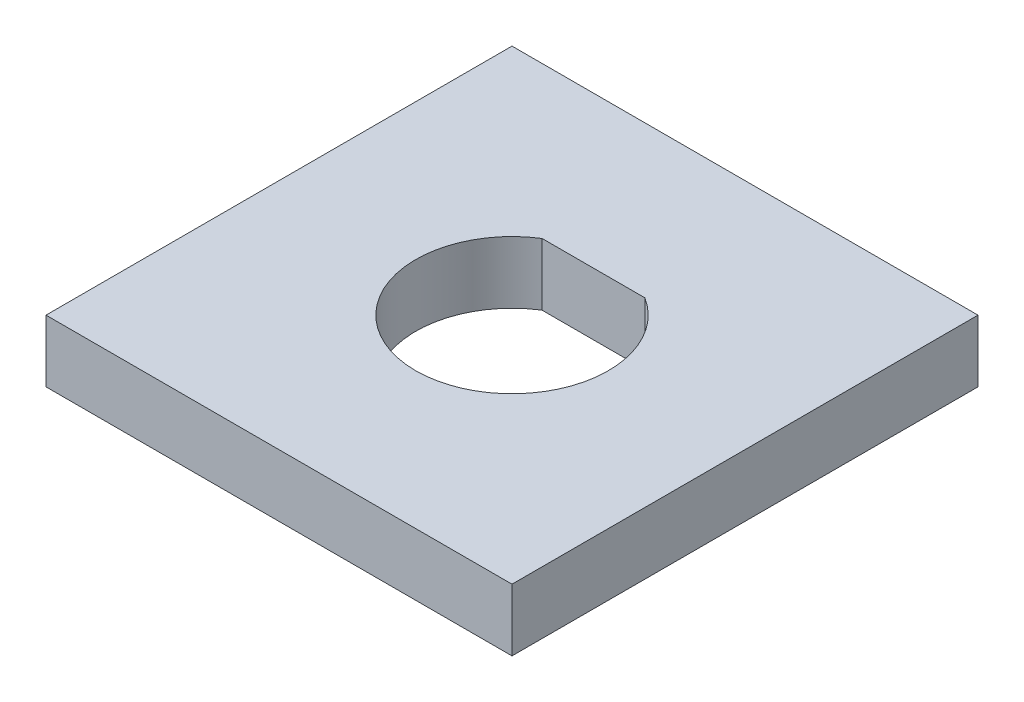
ISO-10303-21;
HEADER;
FILE_DESCRIPTION(('STEP AP214'),'2;1');
FILE_NAME('part.step','',(''),(''),'','','');
FILE_SCHEMA(('AUTOMOTIVE_DESIGN { 1 0 10303 214 1 1 1 1 }'));
ENDSEC;
DATA;
#1=APPLICATION_CONTEXT('core data for automotive mechanical design processes');
#2=APPLICATION_PROTOCOL_DEFINITION('international standard','automotive_design',2000,#1);
#3=PRODUCT_CONTEXT('',#1,'mechanical');
#4=PRODUCT('Part','Part','',(#3));
#5=PRODUCT_RELATED_PRODUCT_CATEGORY('part','',(#4));
#6=PRODUCT_DEFINITION_FORMATION('','',#4);
#7=PRODUCT_DEFINITION_CONTEXT('part definition',#1,'design');
#8=PRODUCT_DEFINITION('design','',#6,#7);
#9=PRODUCT_DEFINITION_SHAPE('','',#8);
#10=(LENGTH_UNIT() NAMED_UNIT(*) SI_UNIT(.MILLI.,.METRE.));
#11=(NAMED_UNIT(*) PLANE_ANGLE_UNIT() SI_UNIT($,.RADIAN.));
#12=(NAMED_UNIT(*) SI_UNIT($,.STERADIAN.) SOLID_ANGLE_UNIT());
#13=UNCERTAINTY_MEASURE_WITH_UNIT(LENGTH_MEASURE(1.E-05),#10,'distance_accuracy_value','');
#14=(GEOMETRIC_REPRESENTATION_CONTEXT(3) GLOBAL_UNCERTAINTY_ASSIGNED_CONTEXT((#13)) GLOBAL_UNIT_ASSIGNED_CONTEXT((#10,
#11,#12)) REPRESENTATION_CONTEXT('',''));
#15=CARTESIAN_POINT('',(0.,0.,0.));
#16=DIRECTION('',(0.,0.,1.));
#17=DIRECTION('',(1.,0.,0.));
#18=AXIS2_PLACEMENT_3D('',#15,#16,#17);
#19=CARTESIAN_POINT('',(0.,2.,0.));
#20=DIRECTION('',(0.,-1.,0.));
#21=DIRECTION('',(0.,0.,-1.));
#22=AXIS2_PLACEMENT_3D('',#19,#20,#21);
#23=PLANE('',#22);
#24=DIRECTION('',(0.,0.,-1.));
#25=VECTOR('',#24,1.);
#26=CARTESIAN_POINT('',(7.5,2.,7.5));
#27=LINE('',#26,#25);
#28=CARTESIAN_POINT('',(7.5,2.,7.5));
#29=VERTEX_POINT('',#28);
#30=CARTESIAN_POINT('',(7.5,2.,-7.5));
#31=VERTEX_POINT('',#30);
#32=EDGE_CURVE('E119',#29,#31,#27,.T.);
#33=ORIENTED_EDGE('',*,*,#32,.T.);
#34=DIRECTION('',(-1.,0.,0.));
#35=VECTOR('',#34,1.);
#36=CARTESIAN_POINT('',(-7.5,2.,-7.5));
#37=LINE('',#36,#35);
#38=CARTESIAN_POINT('',(-7.5,2.,-7.5));
#39=VERTEX_POINT('',#38);
#40=EDGE_CURVE('E123',#31,#39,#37,.T.);
#41=ORIENTED_EDGE('',*,*,#40,.T.);
#42=DIRECTION('',(0.,0.,1.));
#43=VECTOR('',#42,1.);
#44=CARTESIAN_POINT('',(-7.5,2.,7.5));
#45=LINE('',#44,#43);
#46=CARTESIAN_POINT('',(-7.5,2.,7.5));
#47=VERTEX_POINT('',#46);
#48=EDGE_CURVE('E127',#39,#47,#45,.T.);
#49=ORIENTED_EDGE('',*,*,#48,.T.);
#50=DIRECTION('',(1.,0.,0.));
#51=VECTOR('',#50,1.);
#52=CARTESIAN_POINT('',(-7.5,2.,7.5));
#53=LINE('',#52,#51);
#54=EDGE_CURVE('E130',#47,#29,#53,.T.);
#55=ORIENTED_EDGE('',*,*,#54,.T.);
#56=EDGE_LOOP('',(#33,#41,#49,#55));
#57=FACE_BOUND('',#56,.T.);
#58=CARTESIAN_POINT('',(0.,2.,0.));
#59=DIRECTION('',(0.,1.,0.));
#60=DIRECTION('',(0.,0.,1.));
#61=AXIS2_PLACEMENT_3D('',#58,#59,#60);
#62=CIRCLE('',#61,3.1);
#63=CARTESIAN_POINT('',(-1.655,2.,-2.62125447066858));
#64=VERTEX_POINT('',#63);
#65=CARTESIAN_POINT('',(1.655,2.,-2.62125447066858));
#66=VERTEX_POINT('',#65);
#67=EDGE_CURVE('E103',#64,#66,#62,.T.);
#68=ORIENTED_EDGE('',*,*,#67,.F.);
#69=DIRECTION('',(-1.,0.,0.));
#70=VECTOR('',#69,1.);
#71=CARTESIAN_POINT('',(-1.655,2.,-2.62125447066858));
#72=LINE('',#71,#70);
#73=EDGE_CURVE('E96',#66,#64,#72,.T.);
#74=ORIENTED_EDGE('',*,*,#73,.F.);
#75=EDGE_LOOP('',(#68,#74));
#76=FACE_BOUND('',#75,.T.);
#77=ADVANCED_FACE('F43',(#57,#76),#23,.F.);
#78=CARTESIAN_POINT('',(0.,0.,0.));
#79=DIRECTION('',(0.,-1.,0.));
#80=DIRECTION('',(0.,0.,-1.));
#81=AXIS2_PLACEMENT_3D('',#78,#79,#80);
#82=PLANE('',#81);
#83=DIRECTION('',(0.,0.,-1.));
#84=VECTOR('',#83,1.);
#85=CARTESIAN_POINT('',(7.5,0.,7.5));
#86=LINE('',#85,#84);
#87=CARTESIAN_POINT('',(7.5,0.,7.5));
#88=VERTEX_POINT('',#87);
#89=CARTESIAN_POINT('',(7.5,0.,-7.5));
#90=VERTEX_POINT('',#89);
#91=EDGE_CURVE('E118',#88,#90,#86,.T.);
#92=ORIENTED_EDGE('',*,*,#91,.F.);
#93=DIRECTION('',(1.,0.,0.));
#94=VECTOR('',#93,1.);
#95=CARTESIAN_POINT('',(-7.5,0.,7.5));
#96=LINE('',#95,#94);
#97=CARTESIAN_POINT('',(-7.5,0.,7.5));
#98=VERTEX_POINT('',#97);
#99=EDGE_CURVE('E124',#98,#88,#96,.T.);
#100=ORIENTED_EDGE('',*,*,#99,.F.);
#101=DIRECTION('',(0.,0.,1.));
#102=VECTOR('',#101,1.);
#103=CARTESIAN_POINT('',(-7.5,0.,7.5));
#104=LINE('',#103,#102);
#105=CARTESIAN_POINT('',(-7.5,0.,-7.5));
#106=VERTEX_POINT('',#105);
#107=EDGE_CURVE('E140',#106,#98,#104,.T.);
#108=ORIENTED_EDGE('',*,*,#107,.F.);
#109=DIRECTION('',(-1.,0.,0.));
#110=VECTOR('',#109,1.);
#111=CARTESIAN_POINT('',(-7.5,0.,-7.5));
#112=LINE('',#111,#110);
#113=EDGE_CURVE('E137',#90,#106,#112,.T.);
#114=ORIENTED_EDGE('',*,*,#113,.F.);
#115=EDGE_LOOP('',(#92,#100,#108,#114));
#116=FACE_BOUND('',#115,.T.);
#117=DIRECTION('',(-1.,0.,0.));
#118=VECTOR('',#117,1.);
#119=CARTESIAN_POINT('',(-1.655,0.,-2.62125447066858));
#120=LINE('',#119,#118);
#121=CARTESIAN_POINT('',(1.655,0.,-2.62125447066858));
#122=VERTEX_POINT('',#121);
#123=CARTESIAN_POINT('',(-1.655,0.,-2.62125447066858));
#124=VERTEX_POINT('',#123);
#125=EDGE_CURVE('E109',#122,#124,#120,.T.);
#126=ORIENTED_EDGE('',*,*,#125,.T.);
#127=CARTESIAN_POINT('',(0.,0.,0.));
#128=DIRECTION('',(0.,1.,0.));
#129=DIRECTION('',(0.,0.,1.));
#130=AXIS2_PLACEMENT_3D('',#127,#128,#129);
#131=CIRCLE('',#130,3.1);
#132=EDGE_CURVE('E66',#124,#122,#131,.T.);
#133=ORIENTED_EDGE('',*,*,#132,.T.);
#134=EDGE_LOOP('',(#126,#133));
#135=FACE_BOUND('',#134,.T.);
#136=ADVANCED_FACE('F163',(#116,#135),#82,.T.);
#137=CARTESIAN_POINT('',(7.5,2.,7.5));
#138=DIRECTION('',(-1.,0.,0.));
#139=DIRECTION('',(0.,0.,1.));
#140=AXIS2_PLACEMENT_3D('',#137,#138,#139);
#141=PLANE('',#140);
#142=ORIENTED_EDGE('',*,*,#91,.T.);
#143=DIRECTION('',(0.,-1.,0.));
#144=VECTOR('',#143,1.);
#145=CARTESIAN_POINT('',(7.5,2.,-7.5));
#146=LINE('',#145,#144);
#147=EDGE_CURVE('E11',#31,#90,#146,.T.);
#148=ORIENTED_EDGE('',*,*,#147,.F.);
#149=ORIENTED_EDGE('',*,*,#32,.F.);
#150=DIRECTION('',(0.,-1.,0.));
#151=VECTOR('',#150,1.);
#152=CARTESIAN_POINT('',(7.5,2.,7.5));
#153=LINE('',#152,#151);
#154=EDGE_CURVE('E133',#29,#88,#153,.T.);
#155=ORIENTED_EDGE('',*,*,#154,.T.);
#156=EDGE_LOOP('',(#142,#148,#149,#155));
#157=FACE_BOUND('',#156,.T.);
#158=ADVANCED_FACE('F45',(#157),#141,.F.);
#159=CARTESIAN_POINT('',(-7.5,2.,-7.5));
#160=DIRECTION('',(0.,0.,1.));
#161=DIRECTION('',(1.,0.,0.));
#162=AXIS2_PLACEMENT_3D('',#159,#160,#161);
#163=PLANE('',#162);
#164=ORIENTED_EDGE('',*,*,#113,.T.);
#165=DIRECTION('',(0.,-1.,0.));
#166=VECTOR('',#165,1.);
#167=CARTESIAN_POINT('',(-7.5,2.,-7.5));
#168=LINE('',#167,#166);
#169=EDGE_CURVE('E52',#39,#106,#168,.T.);
#170=ORIENTED_EDGE('',*,*,#169,.F.);
#171=ORIENTED_EDGE('',*,*,#40,.F.);
#172=ORIENTED_EDGE('',*,*,#147,.T.);
#173=EDGE_LOOP('',(#164,#170,#171,#172));
#174=FACE_BOUND('',#173,.T.);
#175=ADVANCED_FACE('F173',(#174),#163,.F.);
#176=CARTESIAN_POINT('',(-7.5,2.,7.5));
#177=DIRECTION('',(1.,0.,0.));
#178=DIRECTION('',(0.,0.,-1.));
#179=AXIS2_PLACEMENT_3D('',#176,#177,#178);
#180=PLANE('',#179);
#181=ORIENTED_EDGE('',*,*,#107,.T.);
#182=DIRECTION('',(0.,-1.,0.));
#183=VECTOR('',#182,1.);
#184=CARTESIAN_POINT('',(-7.5,2.,7.5));
#185=LINE('',#184,#183);
#186=EDGE_CURVE('E148',#47,#98,#185,.T.);
#187=ORIENTED_EDGE('',*,*,#186,.F.);
#188=ORIENTED_EDGE('',*,*,#48,.F.);
#189=ORIENTED_EDGE('',*,*,#169,.T.);
#190=EDGE_LOOP('',(#181,#187,#188,#189));
#191=FACE_BOUND('',#190,.T.);
#192=ADVANCED_FACE('F157',(#191),#180,.F.);
#193=CARTESIAN_POINT('',(-7.5,2.,7.5));
#194=DIRECTION('',(0.,0.,-1.));
#195=DIRECTION('',(-1.,0.,0.));
#196=AXIS2_PLACEMENT_3D('',#193,#194,#195);
#197=PLANE('',#196);
#198=ORIENTED_EDGE('',*,*,#99,.T.);
#199=ORIENTED_EDGE('',*,*,#154,.F.);
#200=ORIENTED_EDGE('',*,*,#54,.F.);
#201=ORIENTED_EDGE('',*,*,#186,.T.);
#202=EDGE_LOOP('',(#198,#199,#200,#201));
#203=FACE_BOUND('',#202,.T.);
#204=ADVANCED_FACE('F167',(#203),#197,.F.);
#205=CARTESIAN_POINT('',(0.,2.,0.));
#206=DIRECTION('',(0.,-1.,0.));
#207=DIRECTION('',(0.,0.,-1.));
#208=AXIS2_PLACEMENT_3D('',#205,#206,#207);
#209=CYLINDRICAL_SURFACE('',#208,3.1);
#210=ORIENTED_EDGE('',*,*,#132,.F.);
#211=DIRECTION('',(0.,-1.,0.));
#212=VECTOR('',#211,1.);
#213=CARTESIAN_POINT('',(-1.655,2.,-2.62125447066858));
#214=LINE('',#213,#212);
#215=EDGE_CURVE('E98',#64,#124,#214,.T.);
#216=ORIENTED_EDGE('',*,*,#215,.F.);
#217=ORIENTED_EDGE('',*,*,#67,.T.);
#218=DIRECTION('',(0.,-1.,0.));
#219=VECTOR('',#218,1.);
#220=CARTESIAN_POINT('',(1.655,2.,-2.62125447066858));
#221=LINE('',#220,#219);
#222=EDGE_CURVE('E59',#66,#122,#221,.T.);
#223=ORIENTED_EDGE('',*,*,#222,.T.);
#224=EDGE_LOOP('',(#210,#216,#217,#223));
#225=FACE_BOUND('',#224,.T.);
#226=ADVANCED_FACE('F105',(#225),#209,.F.);
#227=CARTESIAN_POINT('',(-1.655,2.,-2.62125447066858));
#228=DIRECTION('',(0.,0.,1.));
#229=DIRECTION('',(1.,0.,0.));
#230=AXIS2_PLACEMENT_3D('',#227,#228,#229);
#231=PLANE('',#230);
#232=ORIENTED_EDGE('',*,*,#125,.F.);
#233=ORIENTED_EDGE('',*,*,#222,.F.);
#234=ORIENTED_EDGE('',*,*,#73,.T.);
#235=ORIENTED_EDGE('',*,*,#215,.T.);
#236=EDGE_LOOP('',(#232,#233,#234,#235));
#237=FACE_BOUND('',#236,.T.);
#238=ADVANCED_FACE('F97',(#237),#231,.T.);
#239=CLOSED_SHELL('',(#77,#136,#158,#175,#192,#204,#226,#238));
#240=MANIFOLD_SOLID_BREP('B2',#239);
#241=ADVANCED_BREP_SHAPE_REPRESENTATION('',(#18,#240),#14);
#242=SHAPE_DEFINITION_REPRESENTATION(#9,#241);
ENDSEC;
END-ISO-10303-21;
